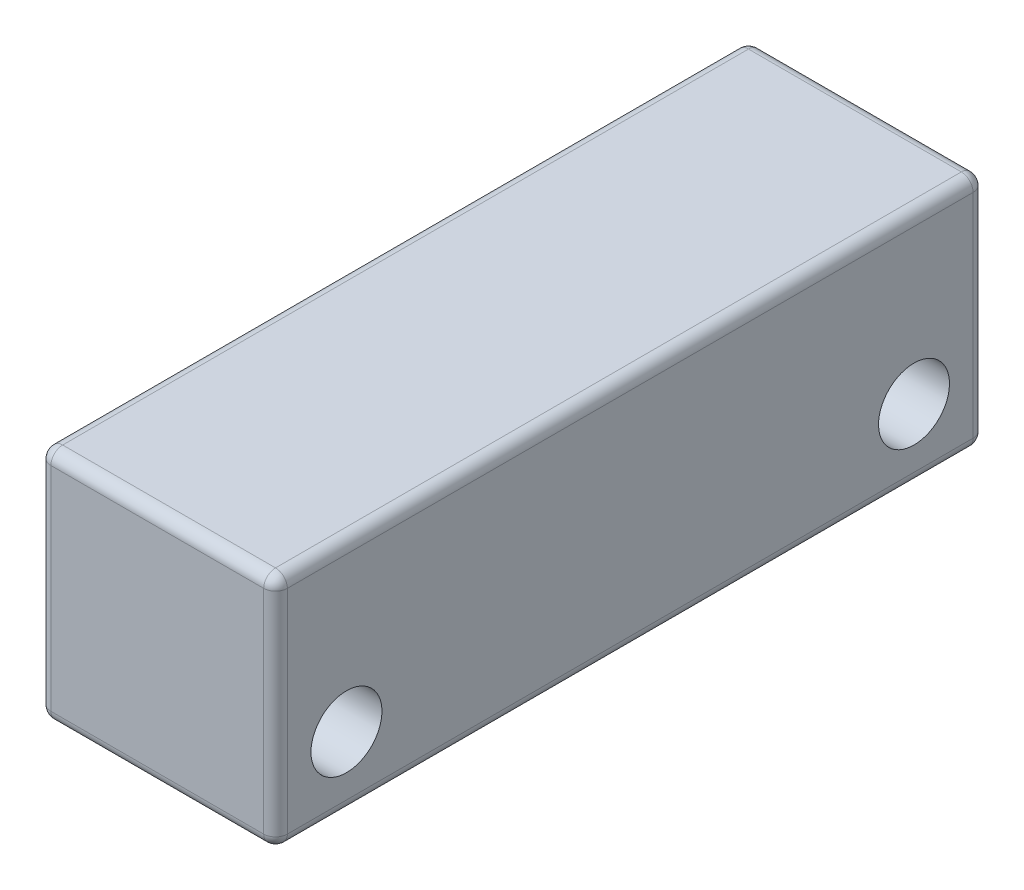
ISO-10303-21;
HEADER;
FILE_DESCRIPTION(('STEP AP214'),'2;1');
FILE_NAME('part.step','',(''),(''),'','','');
FILE_SCHEMA(('AUTOMOTIVE_DESIGN { 1 0 10303 214 1 1 1 1 }'));
ENDSEC;
DATA;
#1=APPLICATION_CONTEXT('core data for automotive mechanical design processes');
#2=APPLICATION_PROTOCOL_DEFINITION('international standard','automotive_design',2000,#1);
#3=PRODUCT_CONTEXT('',#1,'mechanical');
#4=PRODUCT('Part','Part','',(#3));
#5=PRODUCT_RELATED_PRODUCT_CATEGORY('part','',(#4));
#6=PRODUCT_DEFINITION_FORMATION('','',#4);
#7=PRODUCT_DEFINITION_CONTEXT('part definition',#1,'design');
#8=PRODUCT_DEFINITION('design','',#6,#7);
#9=PRODUCT_DEFINITION_SHAPE('','',#8);
#10=(LENGTH_UNIT() NAMED_UNIT(*) SI_UNIT(.MILLI.,.METRE.));
#11=(NAMED_UNIT(*) PLANE_ANGLE_UNIT() SI_UNIT($,.RADIAN.));
#12=(NAMED_UNIT(*) SI_UNIT($,.STERADIAN.) SOLID_ANGLE_UNIT());
#13=UNCERTAINTY_MEASURE_WITH_UNIT(LENGTH_MEASURE(1.E-05),#10,'distance_accuracy_value','');
#14=(GEOMETRIC_REPRESENTATION_CONTEXT(3) GLOBAL_UNCERTAINTY_ASSIGNED_CONTEXT((#13)) GLOBAL_UNIT_ASSIGNED_CONTEXT((#10,
#11,#12)) REPRESENTATION_CONTEXT('',''));
#15=CARTESIAN_POINT('',(0.,0.,0.));
#16=DIRECTION('',(0.,0.,1.));
#17=DIRECTION('',(1.,0.,0.));
#18=AXIS2_PLACEMENT_3D('',#15,#16,#17);
#19=CARTESIAN_POINT('',(5.,5.,30.));
#20=DIRECTION('',(-1.,0.,0.));
#21=DIRECTION('',(0.,0.,1.));
#22=AXIS2_PLACEMENT_3D('',#19,#20,#21);
#23=PLANE('',#22);
#24=CARTESIAN_POINT('',(5.,-2.,27.));
#25=DIRECTION('',(-1.,0.,0.));
#26=DIRECTION('',(0.,0.,1.));
#27=AXIS2_PLACEMENT_3D('',#24,#25,#26);
#28=CIRCLE('',#27,1.5);
#29=CARTESIAN_POINT('',(5.,-2.,28.5));
#30=VERTEX_POINT('',#29);
#31=EDGE_CURVE('E140',#30,#30,#28,.T.);
#32=ORIENTED_EDGE('',*,*,#31,.T.);
#33=EDGE_LOOP('',(#32));
#34=FACE_BOUND('',#33,.T.);
#35=DIRECTION('',(0.,1.,0.));
#36=VECTOR('',#35,1.);
#37=CARTESIAN_POINT('',(5.,5.,0.5));
#38=LINE('',#37,#36);
#39=CARTESIAN_POINT('',(5.,-4.5,0.5));
#40=VERTEX_POINT('',#39);
#41=CARTESIAN_POINT('',(5.,4.5,0.5));
#42=VERTEX_POINT('',#41);
#43=EDGE_CURVE('E188',#40,#42,#38,.T.);
#44=ORIENTED_EDGE('',*,*,#43,.T.);
#45=DIRECTION('',(0.,0.,-1.));
#46=VECTOR('',#45,1.);
#47=CARTESIAN_POINT('',(5.,4.5,30.));
#48=LINE('',#47,#46);
#49=CARTESIAN_POINT('',(5.,4.5,29.5));
#50=VERTEX_POINT('',#49);
#51=EDGE_CURVE('E195',#42,#50,#48,.F.);
#52=ORIENTED_EDGE('',*,*,#51,.T.);
#53=DIRECTION('',(0.,1.,0.));
#54=VECTOR('',#53,1.);
#55=CARTESIAN_POINT('',(5.,-5.,29.5));
#56=LINE('',#55,#54);
#57=CARTESIAN_POINT('',(5.,-4.5,29.5));
#58=VERTEX_POINT('',#57);
#59=EDGE_CURVE('E191',#50,#58,#56,.F.);
#60=ORIENTED_EDGE('',*,*,#59,.T.);
#61=DIRECTION('',(0.,0.,-1.));
#62=VECTOR('',#61,1.);
#63=CARTESIAN_POINT('',(5.,-4.5,30.));
#64=LINE('',#63,#62);
#65=EDGE_CURVE('E185',#58,#40,#64,.T.);
#66=ORIENTED_EDGE('',*,*,#65,.T.);
#67=EDGE_LOOP('',(#44,#52,#60,#66));
#68=FACE_BOUND('',#67,.T.);
#69=CARTESIAN_POINT('',(5.,-2.,3.));
#70=DIRECTION('',(1.,0.,0.));
#71=DIRECTION('',(0.,1.,0.));
#72=AXIS2_PLACEMENT_3D('',#69,#70,#71);
#73=CIRCLE('',#72,1.5);
#74=CARTESIAN_POINT('',(5.,-0.500000000000001,3.));
#75=VERTEX_POINT('',#74);
#76=EDGE_CURVE('E309',#75,#75,#73,.T.);
#77=ORIENTED_EDGE('',*,*,#76,.F.);
#78=EDGE_LOOP('',(#77));
#79=FACE_BOUND('',#78,.T.);
#80=ADVANCED_FACE('F38',(#34,#68,#79),#23,.F.);
#81=CARTESIAN_POINT('',(-5.,5.,30.));
#82=DIRECTION('',(0.,-1.,0.));
#83=DIRECTION('',(0.,0.,-1.));
#84=AXIS2_PLACEMENT_3D('',#81,#82,#83);
#85=PLANE('',#84);
#86=DIRECTION('',(-1.,0.,0.));
#87=VECTOR('',#86,1.);
#88=CARTESIAN_POINT('',(5.,5.,29.5));
#89=LINE('',#88,#87);
#90=CARTESIAN_POINT('',(-4.5,5.,29.5));
#91=VERTEX_POINT('',#90);
#92=CARTESIAN_POINT('',(4.5,5.,29.5));
#93=VERTEX_POINT('',#92);
#94=EDGE_CURVE('E217',#91,#93,#89,.F.);
#95=ORIENTED_EDGE('',*,*,#94,.T.);
#96=DIRECTION('',(0.,0.,-1.));
#97=VECTOR('',#96,1.);
#98=CARTESIAN_POINT('',(4.5,5.,30.));
#99=LINE('',#98,#97);
#100=CARTESIAN_POINT('',(4.5,5.,0.5));
#101=VERTEX_POINT('',#100);
#102=EDGE_CURVE('E220',#93,#101,#99,.T.);
#103=ORIENTED_EDGE('',*,*,#102,.T.);
#104=DIRECTION('',(-1.,0.,0.));
#105=VECTOR('',#104,1.);
#106=CARTESIAN_POINT('',(-5.,5.,0.5));
#107=LINE('',#106,#105);
#108=CARTESIAN_POINT('',(-4.5,5.,0.5));
#109=VERTEX_POINT('',#108);
#110=EDGE_CURVE('E211',#101,#109,#107,.T.);
#111=ORIENTED_EDGE('',*,*,#110,.T.);
#112=DIRECTION('',(0.,0.,-1.));
#113=VECTOR('',#112,1.);
#114=CARTESIAN_POINT('',(-4.5,5.,30.));
#115=LINE('',#114,#113);
#116=EDGE_CURVE('E214',#109,#91,#115,.F.);
#117=ORIENTED_EDGE('',*,*,#116,.T.);
#118=EDGE_LOOP('',(#95,#103,#111,#117));
#119=FACE_BOUND('',#118,.T.);
#120=ADVANCED_FACE('F343',(#119),#85,.F.);
#121=CARTESIAN_POINT('',(-5.,5.,30.));
#122=DIRECTION('',(1.,0.,0.));
#123=DIRECTION('',(0.,0.,-1.));
#124=AXIS2_PLACEMENT_3D('',#121,#122,#123);
#125=PLANE('',#124);
#126=CARTESIAN_POINT('',(-5.,-2.,27.));
#127=DIRECTION('',(-1.,0.,0.));
#128=DIRECTION('',(0.,0.,1.));
#129=AXIS2_PLACEMENT_3D('',#126,#127,#128);
#130=CIRCLE('',#129,1.5);
#131=CARTESIAN_POINT('',(-5.,-2.,28.5));
#132=VERTEX_POINT('',#131);
#133=EDGE_CURVE('E323',#132,#132,#130,.T.);
#134=ORIENTED_EDGE('',*,*,#133,.F.);
#135=EDGE_LOOP('',(#134));
#136=FACE_BOUND('',#135,.T.);
#137=DIRECTION('',(0.,-1.,0.));
#138=VECTOR('',#137,1.);
#139=CARTESIAN_POINT('',(-5.,5.,29.5));
#140=LINE('',#139,#138);
#141=CARTESIAN_POINT('',(-5.,-4.5,29.5));
#142=VERTEX_POINT('',#141);
#143=CARTESIAN_POINT('',(-5.,4.5,29.5));
#144=VERTEX_POINT('',#143);
#145=EDGE_CURVE('E135',#142,#144,#140,.F.);
#146=ORIENTED_EDGE('',*,*,#145,.T.);
#147=DIRECTION('',(0.,0.,-1.));
#148=VECTOR('',#147,1.);
#149=CARTESIAN_POINT('',(-5.,4.5,30.));
#150=LINE('',#149,#148);
#151=CARTESIAN_POINT('',(-5.,4.5,0.5));
#152=VERTEX_POINT('',#151);
#153=EDGE_CURVE('E182',#144,#152,#150,.T.);
#154=ORIENTED_EDGE('',*,*,#153,.T.);
#155=DIRECTION('',(0.,-1.,0.));
#156=VECTOR('',#155,1.);
#157=CARTESIAN_POINT('',(-5.,5.,0.5));
#158=LINE('',#157,#156);
#159=CARTESIAN_POINT('',(-5.,-4.5,0.5));
#160=VERTEX_POINT('',#159);
#161=EDGE_CURVE('E177',#152,#160,#158,.T.);
#162=ORIENTED_EDGE('',*,*,#161,.T.);
#163=DIRECTION('',(0.,0.,-1.));
#164=VECTOR('',#163,1.);
#165=CARTESIAN_POINT('',(-5.,-4.5,30.));
#166=LINE('',#165,#164);
#167=EDGE_CURVE('E171',#160,#142,#166,.F.);
#168=ORIENTED_EDGE('',*,*,#167,.T.);
#169=EDGE_LOOP('',(#146,#154,#162,#168));
#170=FACE_BOUND('',#169,.T.);
#171=CARTESIAN_POINT('',(-5.,-2.,3.));
#172=DIRECTION('',(1.,0.,0.));
#173=DIRECTION('',(0.,0.,-1.));
#174=AXIS2_PLACEMENT_3D('',#171,#172,#173);
#175=CIRCLE('',#174,1.5);
#176=CARTESIAN_POINT('',(-5.,-2.,1.5));
#177=VERTEX_POINT('',#176);
#178=EDGE_CURVE('E161',#177,#177,#175,.T.);
#179=ORIENTED_EDGE('',*,*,#178,.T.);
#180=EDGE_LOOP('',(#179));
#181=FACE_BOUND('',#180,.T.);
#182=ADVANCED_FACE('F339',(#136,#170,#181),#125,.F.);
#183=CARTESIAN_POINT('',(-5.,-5.,30.));
#184=DIRECTION('',(0.,1.,0.));
#185=DIRECTION('',(0.,0.,1.));
#186=AXIS2_PLACEMENT_3D('',#183,#184,#185);
#187=PLANE('',#186);
#188=DIRECTION('',(1.,0.,0.));
#189=VECTOR('',#188,1.);
#190=CARTESIAN_POINT('',(-5.,-5.,29.5));
#191=LINE('',#190,#189);
#192=CARTESIAN_POINT('',(4.5,-5.,29.5));
#193=VERTEX_POINT('',#192);
#194=CARTESIAN_POINT('',(-4.5,-5.,29.5));
#195=VERTEX_POINT('',#194);
#196=EDGE_CURVE('E48',#193,#195,#191,.F.);
#197=ORIENTED_EDGE('',*,*,#196,.T.);
#198=DIRECTION('',(0.,0.,-1.));
#199=VECTOR('',#198,1.);
#200=CARTESIAN_POINT('',(-4.5,-5.,30.));
#201=LINE('',#200,#199);
#202=CARTESIAN_POINT('',(-4.5,-5.,0.5));
#203=VERTEX_POINT('',#202);
#204=EDGE_CURVE('E11',#195,#203,#201,.T.);
#205=ORIENTED_EDGE('',*,*,#204,.T.);
#206=DIRECTION('',(1.,0.,0.));
#207=VECTOR('',#206,1.);
#208=CARTESIAN_POINT('',(-5.,-5.,0.5));
#209=LINE('',#208,#207);
#210=CARTESIAN_POINT('',(4.5,-5.,0.5));
#211=VERTEX_POINT('',#210);
#212=EDGE_CURVE('E224',#203,#211,#209,.T.);
#213=ORIENTED_EDGE('',*,*,#212,.T.);
#214=DIRECTION('',(0.,0.,-1.));
#215=VECTOR('',#214,1.);
#216=CARTESIAN_POINT('',(4.5,-5.,30.));
#217=LINE('',#216,#215);
#218=EDGE_CURVE('E59',#211,#193,#217,.F.);
#219=ORIENTED_EDGE('',*,*,#218,.T.);
#220=EDGE_LOOP('',(#197,#205,#213,#219));
#221=FACE_BOUND('',#220,.T.);
#222=ADVANCED_FACE('F342',(#221),#187,.F.);
#223=CARTESIAN_POINT('',(0.,0.,30.));
#224=DIRECTION('',(0.,0.,1.));
#225=DIRECTION('',(1.,0.,0.));
#226=AXIS2_PLACEMENT_3D('',#223,#224,#225);
#227=PLANE('',#226);
#228=DIRECTION('',(0.,1.,0.));
#229=VECTOR('',#228,1.);
#230=CARTESIAN_POINT('',(4.5,5.,30.));
#231=LINE('',#230,#229);
#232=CARTESIAN_POINT('',(4.5,-4.5,30.));
#233=VERTEX_POINT('',#232);
#234=CARTESIAN_POINT('',(4.5,4.5,30.));
#235=VERTEX_POINT('',#234);
#236=EDGE_CURVE('E160',#233,#235,#231,.T.);
#237=ORIENTED_EDGE('',*,*,#236,.T.);
#238=DIRECTION('',(-1.,0.,0.));
#239=VECTOR('',#238,1.);
#240=CARTESIAN_POINT('',(-5.,4.5,30.));
#241=LINE('',#240,#239);
#242=CARTESIAN_POINT('',(-4.5,4.5,30.));
#243=VERTEX_POINT('',#242);
#244=EDGE_CURVE('E165',#235,#243,#241,.T.);
#245=ORIENTED_EDGE('',*,*,#244,.T.);
#246=DIRECTION('',(0.,-1.,0.));
#247=VECTOR('',#246,1.);
#248=CARTESIAN_POINT('',(-4.5,-5.,30.));
#249=LINE('',#248,#247);
#250=CARTESIAN_POINT('',(-4.5,-4.5,30.));
#251=VERTEX_POINT('',#250);
#252=EDGE_CURVE('E133',#243,#251,#249,.T.);
#253=ORIENTED_EDGE('',*,*,#252,.T.);
#254=DIRECTION('',(1.,0.,0.));
#255=VECTOR('',#254,1.);
#256=CARTESIAN_POINT('',(5.,-4.5,30.));
#257=LINE('',#256,#255);
#258=EDGE_CURVE('E153',#251,#233,#257,.T.);
#259=ORIENTED_EDGE('',*,*,#258,.T.);
#260=EDGE_LOOP('',(#237,#245,#253,#259));
#261=FACE_BOUND('',#260,.T.);
#262=ADVANCED_FACE('F163',(#261),#227,.T.);
#263=CARTESIAN_POINT('',(0.,0.,0.));
#264=DIRECTION('',(0.,0.,1.));
#265=DIRECTION('',(1.,0.,0.));
#266=AXIS2_PLACEMENT_3D('',#263,#264,#265);
#267=PLANE('',#266);
#268=DIRECTION('',(0.,-1.,0.));
#269=VECTOR('',#268,1.);
#270=CARTESIAN_POINT('',(-4.5,0.,0.));
#271=LINE('',#270,#269);
#272=CARTESIAN_POINT('',(-4.5,-4.5,0.));
#273=VERTEX_POINT('',#272);
#274=CARTESIAN_POINT('',(-4.5,4.5,0.));
#275=VERTEX_POINT('',#274);
#276=EDGE_CURVE('E204',#273,#275,#271,.F.);
#277=ORIENTED_EDGE('',*,*,#276,.T.);
#278=DIRECTION('',(-1.,0.,0.));
#279=VECTOR('',#278,1.);
#280=CARTESIAN_POINT('',(0.,4.5,0.));
#281=LINE('',#280,#279);
#282=CARTESIAN_POINT('',(4.5,4.5,0.));
#283=VERTEX_POINT('',#282);
#284=EDGE_CURVE('E208',#275,#283,#281,.F.);
#285=ORIENTED_EDGE('',*,*,#284,.T.);
#286=DIRECTION('',(0.,1.,0.));
#287=VECTOR('',#286,1.);
#288=CARTESIAN_POINT('',(4.5,0.,0.));
#289=LINE('',#288,#287);
#290=CARTESIAN_POINT('',(4.5,-4.5,0.));
#291=VERTEX_POINT('',#290);
#292=EDGE_CURVE('E201',#283,#291,#289,.F.);
#293=ORIENTED_EDGE('',*,*,#292,.T.);
#294=DIRECTION('',(1.,0.,0.));
#295=VECTOR('',#294,1.);
#296=CARTESIAN_POINT('',(0.,-4.5,0.));
#297=LINE('',#296,#295);
#298=EDGE_CURVE('E198',#291,#273,#297,.F.);
#299=ORIENTED_EDGE('',*,*,#298,.T.);
#300=EDGE_LOOP('',(#277,#285,#293,#299));
#301=FACE_BOUND('',#300,.T.);
#302=ADVANCED_FACE('F350',(#301),#267,.F.);
#303=CARTESIAN_POINT('',(-25.,-2.,3.));
#304=DIRECTION('',(1.,0.,0.));
#305=DIRECTION('',(0.,1.,0.));
#306=AXIS2_PLACEMENT_3D('',#303,#304,#305);
#307=CYLINDRICAL_SURFACE('',#306,1.5);
#308=ORIENTED_EDGE('',*,*,#76,.T.);
#309=EDGE_LOOP('',(#308));
#310=FACE_BOUND('',#309,.T.);
#311=ORIENTED_EDGE('',*,*,#178,.F.);
#312=EDGE_LOOP('',(#311));
#313=FACE_BOUND('',#312,.T.);
#314=ADVANCED_FACE('F348',(#310,#313),#307,.F.);
#315=CARTESIAN_POINT('',(4.5,5.,0.5));
#316=DIRECTION('',(0.,1.,0.));
#317=DIRECTION('',(0.,0.,1.));
#318=AXIS2_PLACEMENT_3D('',#315,#316,#317);
#319=CYLINDRICAL_SURFACE('',#318,0.5);
#320=CARTESIAN_POINT('',(4.5,4.5,0.5));
#321=DIRECTION('',(0.,1.,0.));
#322=DIRECTION('',(0.,0.,1.));
#323=AXIS2_PLACEMENT_3D('',#320,#321,#322);
#324=CIRCLE('',#323,0.5);
#325=EDGE_CURVE('E42',#42,#283,#324,.T.);
#326=ORIENTED_EDGE('',*,*,#325,.F.);
#327=ORIENTED_EDGE('',*,*,#43,.F.);
#328=CARTESIAN_POINT('',(4.5,-4.5,0.5));
#329=DIRECTION('',(0.,-1.,0.));
#330=DIRECTION('',(0.,0.,-1.));
#331=AXIS2_PLACEMENT_3D('',#328,#329,#330);
#332=CIRCLE('',#331,0.5);
#333=EDGE_CURVE('E300',#291,#40,#332,.T.);
#334=ORIENTED_EDGE('',*,*,#333,.F.);
#335=ORIENTED_EDGE('',*,*,#292,.F.);
#336=EDGE_LOOP('',(#326,#327,#334,#335));
#337=FACE_BOUND('',#336,.T.);
#338=ADVANCED_FACE('F40',(#337),#319,.T.);
#339=CARTESIAN_POINT('',(4.5,4.5,0.5));
#340=DIRECTION('',(0.,0.,-1.));
#341=DIRECTION('',(-1.,0.,0.));
#342=AXIS2_PLACEMENT_3D('',#339,#340,#341);
#343=SPHERICAL_SURFACE('',#342,0.5);
#344=CARTESIAN_POINT('',(4.5,4.5,0.5));
#345=DIRECTION('',(0.,0.,-1.));
#346=DIRECTION('',(-1.,0.,0.));
#347=AXIS2_PLACEMENT_3D('',#344,#345,#346);
#348=CIRCLE('',#347,0.5);
#349=EDGE_CURVE('E293',#42,#101,#348,.F.);
#350=ORIENTED_EDGE('',*,*,#349,.F.);
#351=ORIENTED_EDGE('',*,*,#325,.T.);
#352=CARTESIAN_POINT('',(4.5,4.5,0.5));
#353=DIRECTION('',(1.,0.,0.));
#354=DIRECTION('',(0.,1.,0.));
#355=AXIS2_PLACEMENT_3D('',#352,#353,#354);
#356=CIRCLE('',#355,0.5);
#357=EDGE_CURVE('E297',#101,#283,#356,.F.);
#358=ORIENTED_EDGE('',*,*,#357,.F.);
#359=EDGE_LOOP('',(#350,#351,#358));
#360=FACE_BOUND('',#359,.T.);
#361=ADVANCED_FACE('F356',(#360),#343,.T.);
#362=CARTESIAN_POINT('',(4.5,-4.5,0.5));
#363=DIRECTION('',(1.,0.,0.));
#364=DIRECTION('',(0.,0.,-1.));
#365=AXIS2_PLACEMENT_3D('',#362,#363,#364);
#366=SPHERICAL_SURFACE('',#365,0.5);
#367=CARTESIAN_POINT('',(4.5,-4.5,0.5));
#368=DIRECTION('',(1.,0.,0.));
#369=DIRECTION('',(0.,0.,-1.));
#370=AXIS2_PLACEMENT_3D('',#367,#368,#369);
#371=CIRCLE('',#370,0.5);
#372=EDGE_CURVE('E285',#291,#211,#371,.F.);
#373=ORIENTED_EDGE('',*,*,#372,.F.);
#374=ORIENTED_EDGE('',*,*,#333,.T.);
#375=CARTESIAN_POINT('',(4.5,-4.5,0.5));
#376=DIRECTION('',(0.,0.,-1.));
#377=DIRECTION('',(-1.,0.,0.));
#378=AXIS2_PLACEMENT_3D('',#375,#376,#377);
#379=CIRCLE('',#378,0.5);
#380=EDGE_CURVE('E289',#211,#40,#379,.F.);
#381=ORIENTED_EDGE('',*,*,#380,.F.);
#382=EDGE_LOOP('',(#373,#374,#381));
#383=FACE_BOUND('',#382,.T.);
#384=ADVANCED_FACE('F431',(#383),#366,.T.);
#385=CARTESIAN_POINT('',(-5.,4.5,0.5));
#386=DIRECTION('',(-1.,0.,0.));
#387=DIRECTION('',(0.,0.,1.));
#388=AXIS2_PLACEMENT_3D('',#385,#386,#387);
#389=CYLINDRICAL_SURFACE('',#388,0.5);
#390=ORIENTED_EDGE('',*,*,#357,.T.);
#391=ORIENTED_EDGE('',*,*,#284,.F.);
#392=CARTESIAN_POINT('',(-4.5,4.5,0.5));
#393=DIRECTION('',(-1.,0.,0.));
#394=DIRECTION('',(0.,0.,1.));
#395=AXIS2_PLACEMENT_3D('',#392,#393,#394);
#396=CIRCLE('',#395,0.5);
#397=EDGE_CURVE('E278',#109,#275,#396,.T.);
#398=ORIENTED_EDGE('',*,*,#397,.F.);
#399=ORIENTED_EDGE('',*,*,#110,.F.);
#400=EDGE_LOOP('',(#390,#391,#398,#399));
#401=FACE_BOUND('',#400,.T.);
#402=ADVANCED_FACE('F427',(#401),#389,.T.);
#403=CARTESIAN_POINT('',(4.5,4.5,30.));
#404=DIRECTION('',(0.,0.,-1.));
#405=DIRECTION('',(-1.,0.,0.));
#406=AXIS2_PLACEMENT_3D('',#403,#404,#405);
#407=CYLINDRICAL_SURFACE('',#406,0.5);
#408=ORIENTED_EDGE('',*,*,#349,.T.);
#409=ORIENTED_EDGE('',*,*,#102,.F.);
#410=CARTESIAN_POINT('',(4.5,4.5,29.5));
#411=DIRECTION('',(0.,0.,1.));
#412=DIRECTION('',(1.,0.,0.));
#413=AXIS2_PLACEMENT_3D('',#410,#411,#412);
#414=CIRCLE('',#413,0.5);
#415=EDGE_CURVE('E274',#50,#93,#414,.T.);
#416=ORIENTED_EDGE('',*,*,#415,.F.);
#417=ORIENTED_EDGE('',*,*,#51,.F.);
#418=EDGE_LOOP('',(#408,#409,#416,#417));
#419=FACE_BOUND('',#418,.T.);
#420=ADVANCED_FACE('F423',(#419),#407,.T.);
#421=CARTESIAN_POINT('',(4.5,0.,29.5));
#422=DIRECTION('',(0.,-1.,0.));
#423=DIRECTION('',(0.,0.,-1.));
#424=AXIS2_PLACEMENT_3D('',#421,#422,#423);
#425=CYLINDRICAL_SURFACE('',#424,0.5);
#426=CARTESIAN_POINT('',(4.5,-4.5,29.5));
#427=DIRECTION('',(0.,-1.,0.));
#428=DIRECTION('',(0.,0.,-1.));
#429=AXIS2_PLACEMENT_3D('',#426,#427,#428);
#430=CIRCLE('',#429,0.5);
#431=EDGE_CURVE('E266',#58,#233,#430,.T.);
#432=ORIENTED_EDGE('',*,*,#431,.F.);
#433=ORIENTED_EDGE('',*,*,#59,.F.);
#434=CARTESIAN_POINT('',(4.5,4.5,29.5));
#435=DIRECTION('',(0.,1.,0.));
#436=DIRECTION('',(0.,0.,1.));
#437=AXIS2_PLACEMENT_3D('',#434,#435,#436);
#438=CIRCLE('',#437,0.5);
#439=EDGE_CURVE('E270',#235,#50,#438,.T.);
#440=ORIENTED_EDGE('',*,*,#439,.F.);
#441=ORIENTED_EDGE('',*,*,#236,.F.);
#442=EDGE_LOOP('',(#432,#433,#440,#441));
#443=FACE_BOUND('',#442,.T.);
#444=ADVANCED_FACE('F419',(#443),#425,.T.);
#445=CARTESIAN_POINT('',(4.5,-4.5,30.));
#446=DIRECTION('',(0.,0.,-1.));
#447=DIRECTION('',(-1.,0.,0.));
#448=AXIS2_PLACEMENT_3D('',#445,#446,#447);
#449=CYLINDRICAL_SURFACE('',#448,0.5);
#450=ORIENTED_EDGE('',*,*,#380,.T.);
#451=ORIENTED_EDGE('',*,*,#65,.F.);
#452=CARTESIAN_POINT('',(4.5,-4.5,29.5));
#453=DIRECTION('',(0.,0.,1.));
#454=DIRECTION('',(1.,0.,0.));
#455=AXIS2_PLACEMENT_3D('',#452,#453,#454);
#456=CIRCLE('',#455,0.5);
#457=EDGE_CURVE('E263',#193,#58,#456,.T.);
#458=ORIENTED_EDGE('',*,*,#457,.F.);
#459=ORIENTED_EDGE('',*,*,#218,.F.);
#460=EDGE_LOOP('',(#450,#451,#458,#459));
#461=FACE_BOUND('',#460,.T.);
#462=ADVANCED_FACE('F415',(#461),#449,.T.);
#463=CARTESIAN_POINT('',(-5.,-4.5,0.5));
#464=DIRECTION('',(1.,0.,0.));
#465=DIRECTION('',(0.,0.,-1.));
#466=AXIS2_PLACEMENT_3D('',#463,#464,#465);
#467=CYLINDRICAL_SURFACE('',#466,0.5);
#468=ORIENTED_EDGE('',*,*,#372,.T.);
#469=ORIENTED_EDGE('',*,*,#212,.F.);
#470=CARTESIAN_POINT('',(-4.5,-4.5,0.5));
#471=DIRECTION('',(-1.,0.,0.));
#472=DIRECTION('',(0.,0.,1.));
#473=AXIS2_PLACEMENT_3D('',#470,#471,#472);
#474=CIRCLE('',#473,0.5);
#475=EDGE_CURVE('E259',#273,#203,#474,.T.);
#476=ORIENTED_EDGE('',*,*,#475,.F.);
#477=ORIENTED_EDGE('',*,*,#298,.F.);
#478=EDGE_LOOP('',(#468,#469,#476,#477));
#479=FACE_BOUND('',#478,.T.);
#480=ADVANCED_FACE('F411',(#479),#467,.T.);
#481=CARTESIAN_POINT('',(-4.5,5.,0.5));
#482=DIRECTION('',(0.,-1.,0.));
#483=DIRECTION('',(0.,0.,-1.));
#484=AXIS2_PLACEMENT_3D('',#481,#482,#483);
#485=CYLINDRICAL_SURFACE('',#484,0.5);
#486=CARTESIAN_POINT('',(-4.5,4.5,0.5));
#487=DIRECTION('',(0.,1.,0.));
#488=DIRECTION('',(0.,0.,1.));
#489=AXIS2_PLACEMENT_3D('',#486,#487,#488);
#490=CIRCLE('',#489,0.5);
#491=EDGE_CURVE('E281',#275,#152,#490,.T.);
#492=ORIENTED_EDGE('',*,*,#491,.F.);
#493=ORIENTED_EDGE('',*,*,#276,.F.);
#494=CARTESIAN_POINT('',(-4.5,-4.5,0.5));
#495=DIRECTION('',(0.,-1.,0.));
#496=DIRECTION('',(0.,0.,-1.));
#497=AXIS2_PLACEMENT_3D('',#494,#495,#496);
#498=CIRCLE('',#497,0.5);
#499=EDGE_CURVE('E255',#160,#273,#498,.T.);
#500=ORIENTED_EDGE('',*,*,#499,.F.);
#501=ORIENTED_EDGE('',*,*,#161,.F.);
#502=EDGE_LOOP('',(#492,#493,#500,#501));
#503=FACE_BOUND('',#502,.T.);
#504=ADVANCED_FACE('F407',(#503),#485,.T.);
#505=CARTESIAN_POINT('',(-4.5,4.5,0.5));
#506=DIRECTION('',(0.,0.,-1.));
#507=DIRECTION('',(-1.,0.,0.));
#508=AXIS2_PLACEMENT_3D('',#505,#506,#507);
#509=SPHERICAL_SURFACE('',#508,0.5);
#510=ORIENTED_EDGE('',*,*,#397,.T.);
#511=ORIENTED_EDGE('',*,*,#491,.T.);
#512=CARTESIAN_POINT('',(-4.5,4.5,0.5));
#513=DIRECTION('',(0.,0.,-1.));
#514=DIRECTION('',(-1.,0.,0.));
#515=AXIS2_PLACEMENT_3D('',#512,#513,#514);
#516=CIRCLE('',#515,0.5);
#517=EDGE_CURVE('E251',#109,#152,#516,.F.);
#518=ORIENTED_EDGE('',*,*,#517,.F.);
#519=EDGE_LOOP('',(#510,#511,#518));
#520=FACE_BOUND('',#519,.T.);
#521=ADVANCED_FACE('F403',(#520),#509,.T.);
#522=CARTESIAN_POINT('',(4.5,4.5,29.5));
#523=DIRECTION('',(1.,0.,0.));
#524=DIRECTION('',(0.,0.,-1.));
#525=AXIS2_PLACEMENT_3D('',#522,#523,#524);
#526=SPHERICAL_SURFACE('',#525,0.5);
#527=ORIENTED_EDGE('',*,*,#439,.T.);
#528=ORIENTED_EDGE('',*,*,#415,.T.);
#529=CARTESIAN_POINT('',(4.5,4.5,29.5));
#530=DIRECTION('',(1.,0.,0.));
#531=DIRECTION('',(0.,0.,-1.));
#532=AXIS2_PLACEMENT_3D('',#529,#530,#531);
#533=CIRCLE('',#532,0.5);
#534=EDGE_CURVE('E247',#235,#93,#533,.F.);
#535=ORIENTED_EDGE('',*,*,#534,.F.);
#536=EDGE_LOOP('',(#527,#528,#535));
#537=FACE_BOUND('',#536,.T.);
#538=ADVANCED_FACE('F399',(#537),#526,.T.);
#539=CARTESIAN_POINT('',(4.5,-4.5,29.5));
#540=DIRECTION('',(1.,0.,0.));
#541=DIRECTION('',(0.,0.,-1.));
#542=AXIS2_PLACEMENT_3D('',#539,#540,#541);
#543=SPHERICAL_SURFACE('',#542,0.5);
#544=ORIENTED_EDGE('',*,*,#457,.T.);
#545=ORIENTED_EDGE('',*,*,#431,.T.);
#546=CARTESIAN_POINT('',(4.5,-4.5,29.5));
#547=DIRECTION('',(1.,0.,0.));
#548=DIRECTION('',(0.,0.,-1.));
#549=AXIS2_PLACEMENT_3D('',#546,#547,#548);
#550=CIRCLE('',#549,0.5);
#551=EDGE_CURVE('E156',#193,#233,#550,.F.);
#552=ORIENTED_EDGE('',*,*,#551,.F.);
#553=EDGE_LOOP('',(#544,#545,#552));
#554=FACE_BOUND('',#553,.T.);
#555=ADVANCED_FACE('F395',(#554),#543,.T.);
#556=CARTESIAN_POINT('',(-4.5,-4.5,0.5));
#557=DIRECTION('',(0.,0.,-1.));
#558=DIRECTION('',(-1.,0.,0.));
#559=AXIS2_PLACEMENT_3D('',#556,#557,#558);
#560=SPHERICAL_SURFACE('',#559,0.5);
#561=ORIENTED_EDGE('',*,*,#499,.T.);
#562=ORIENTED_EDGE('',*,*,#475,.T.);
#563=CARTESIAN_POINT('',(-4.5,-4.5,0.5));
#564=DIRECTION('',(0.,0.,-1.));
#565=DIRECTION('',(-1.,0.,0.));
#566=AXIS2_PLACEMENT_3D('',#563,#564,#565);
#567=CIRCLE('',#566,0.5);
#568=EDGE_CURVE('E242',#160,#203,#567,.F.);
#569=ORIENTED_EDGE('',*,*,#568,.F.);
#570=EDGE_LOOP('',(#561,#562,#569));
#571=FACE_BOUND('',#570,.T.);
#572=ADVANCED_FACE('F391',(#571),#560,.T.);
#573=CARTESIAN_POINT('',(-4.5,4.5,30.));
#574=DIRECTION('',(0.,0.,-1.));
#575=DIRECTION('',(-1.,0.,0.));
#576=AXIS2_PLACEMENT_3D('',#573,#574,#575);
#577=CYLINDRICAL_SURFACE('',#576,0.5);
#578=ORIENTED_EDGE('',*,*,#517,.T.);
#579=ORIENTED_EDGE('',*,*,#153,.F.);
#580=CARTESIAN_POINT('',(-4.5,4.5,29.5));
#581=DIRECTION('',(0.,0.,1.));
#582=DIRECTION('',(1.,0.,0.));
#583=AXIS2_PLACEMENT_3D('',#580,#581,#582);
#584=CIRCLE('',#583,0.5);
#585=EDGE_CURVE('E238',#91,#144,#584,.T.);
#586=ORIENTED_EDGE('',*,*,#585,.F.);
#587=ORIENTED_EDGE('',*,*,#116,.F.);
#588=EDGE_LOOP('',(#578,#579,#586,#587));
#589=FACE_BOUND('',#588,.T.);
#590=ADVANCED_FACE('F387',(#589),#577,.T.);
#591=CARTESIAN_POINT('',(0.,4.5,29.5));
#592=DIRECTION('',(1.,0.,0.));
#593=DIRECTION('',(0.,0.,-1.));
#594=AXIS2_PLACEMENT_3D('',#591,#592,#593);
#595=CYLINDRICAL_SURFACE('',#594,0.5);
#596=ORIENTED_EDGE('',*,*,#534,.T.);
#597=ORIENTED_EDGE('',*,*,#94,.F.);
#598=CARTESIAN_POINT('',(-4.5,4.5,29.5));
#599=DIRECTION('',(-1.,0.,0.));
#600=DIRECTION('',(0.,0.,1.));
#601=AXIS2_PLACEMENT_3D('',#598,#599,#600);
#602=CIRCLE('',#601,0.5);
#603=EDGE_CURVE('E150',#243,#91,#602,.T.);
#604=ORIENTED_EDGE('',*,*,#603,.F.);
#605=ORIENTED_EDGE('',*,*,#244,.F.);
#606=EDGE_LOOP('',(#596,#597,#604,#605));
#607=FACE_BOUND('',#606,.T.);
#608=ADVANCED_FACE('F384',(#607),#595,.T.);
#609=CARTESIAN_POINT('',(0.,-4.5,29.5));
#610=DIRECTION('',(-1.,0.,0.));
#611=DIRECTION('',(0.,0.,1.));
#612=AXIS2_PLACEMENT_3D('',#609,#610,#611);
#613=CYLINDRICAL_SURFACE('',#612,0.5);
#614=ORIENTED_EDGE('',*,*,#551,.T.);
#615=ORIENTED_EDGE('',*,*,#258,.F.);
#616=CARTESIAN_POINT('',(-4.5,-4.5,29.5));
#617=DIRECTION('',(-1.,0.,0.));
#618=DIRECTION('',(0.,0.,1.));
#619=AXIS2_PLACEMENT_3D('',#616,#617,#618);
#620=CIRCLE('',#619,0.5);
#621=EDGE_CURVE('E143',#195,#251,#620,.T.);
#622=ORIENTED_EDGE('',*,*,#621,.F.);
#623=ORIENTED_EDGE('',*,*,#196,.F.);
#624=EDGE_LOOP('',(#614,#615,#622,#623));
#625=FACE_BOUND('',#624,.T.);
#626=ADVANCED_FACE('F154',(#625),#613,.T.);
#627=CARTESIAN_POINT('',(-4.5,-4.5,30.));
#628=DIRECTION('',(0.,0.,-1.));
#629=DIRECTION('',(-1.,0.,0.));
#630=AXIS2_PLACEMENT_3D('',#627,#628,#629);
#631=CYLINDRICAL_SURFACE('',#630,0.5);
#632=ORIENTED_EDGE('',*,*,#568,.T.);
#633=ORIENTED_EDGE('',*,*,#204,.F.);
#634=CARTESIAN_POINT('',(-4.5,-4.5,29.5));
#635=DIRECTION('',(0.,0.,1.));
#636=DIRECTION('',(1.,0.,0.));
#637=AXIS2_PLACEMENT_3D('',#634,#635,#636);
#638=CIRCLE('',#637,0.5);
#639=EDGE_CURVE('E147',#142,#195,#638,.T.);
#640=ORIENTED_EDGE('',*,*,#639,.F.);
#641=ORIENTED_EDGE('',*,*,#167,.F.);
#642=EDGE_LOOP('',(#632,#633,#640,#641));
#643=FACE_BOUND('',#642,.T.);
#644=ADVANCED_FACE('F377',(#643),#631,.T.);
#645=CARTESIAN_POINT('',(-4.5,4.5,29.5));
#646=DIRECTION('',(0.,1.,0.));
#647=DIRECTION('',(0.,0.,1.));
#648=AXIS2_PLACEMENT_3D('',#645,#646,#647);
#649=SPHERICAL_SURFACE('',#648,0.5);
#650=ORIENTED_EDGE('',*,*,#603,.T.);
#651=ORIENTED_EDGE('',*,*,#585,.T.);
#652=CARTESIAN_POINT('',(-4.5,4.5,29.5));
#653=DIRECTION('',(0.,1.,0.));
#654=DIRECTION('',(0.,0.,1.));
#655=AXIS2_PLACEMENT_3D('',#652,#653,#654);
#656=CIRCLE('',#655,0.5);
#657=EDGE_CURVE('E139',#243,#144,#656,.F.);
#658=ORIENTED_EDGE('',*,*,#657,.F.);
#659=EDGE_LOOP('',(#650,#651,#658));
#660=FACE_BOUND('',#659,.T.);
#661=ADVANCED_FACE('F374',(#660),#649,.T.);
#662=CARTESIAN_POINT('',(-4.5,-4.5,29.5));
#663=DIRECTION('',(0.,-1.,0.));
#664=DIRECTION('',(0.,0.,-1.));
#665=AXIS2_PLACEMENT_3D('',#662,#663,#664);
#666=SPHERICAL_SURFACE('',#665,0.5);
#667=ORIENTED_EDGE('',*,*,#639,.T.);
#668=ORIENTED_EDGE('',*,*,#621,.T.);
#669=CARTESIAN_POINT('',(-4.5,-4.5,29.5));
#670=DIRECTION('',(0.,-1.,0.));
#671=DIRECTION('',(0.,0.,-1.));
#672=AXIS2_PLACEMENT_3D('',#669,#670,#671);
#673=CIRCLE('',#672,0.5);
#674=EDGE_CURVE('E129',#142,#251,#673,.F.);
#675=ORIENTED_EDGE('',*,*,#674,.F.);
#676=EDGE_LOOP('',(#667,#668,#675));
#677=FACE_BOUND('',#676,.T.);
#678=ADVANCED_FACE('F145',(#677),#666,.T.);
#679=CARTESIAN_POINT('',(-4.5,0.,29.5));
#680=DIRECTION('',(0.,1.,0.));
#681=DIRECTION('',(0.,0.,1.));
#682=AXIS2_PLACEMENT_3D('',#679,#680,#681);
#683=CYLINDRICAL_SURFACE('',#682,0.5);
#684=ORIENTED_EDGE('',*,*,#657,.T.);
#685=ORIENTED_EDGE('',*,*,#145,.F.);
#686=ORIENTED_EDGE('',*,*,#674,.T.);
#687=ORIENTED_EDGE('',*,*,#252,.F.);
#688=EDGE_LOOP('',(#684,#685,#686,#687));
#689=FACE_BOUND('',#688,.T.);
#690=ADVANCED_FACE('F131',(#689),#683,.T.);
#691=CARTESIAN_POINT('',(5.,-2.,27.));
#692=DIRECTION('',(-1.,0.,0.));
#693=DIRECTION('',(0.,0.,1.));
#694=AXIS2_PLACEMENT_3D('',#691,#692,#693);
#695=CYLINDRICAL_SURFACE('',#694,1.5);
#696=ORIENTED_EDGE('',*,*,#31,.F.);
#697=EDGE_LOOP('',(#696));
#698=FACE_BOUND('',#697,.T.);
#699=ORIENTED_EDGE('',*,*,#133,.T.);
#700=EDGE_LOOP('',(#699));
#701=FACE_BOUND('',#700,.T.);
#702=ADVANCED_FACE('F333',(#698,#701),#695,.F.);
#703=CLOSED_SHELL('',(#80,#120,#182,#222,#262,#302,#314,#338,#361,#384,#402,#420,#444,#462,#480,
#504,#521,#538,#555,#572,#590,#608,#626,#644,#661,#678,#690,#702));
#704=MANIFOLD_SOLID_BREP('B2',#703);
#705=ADVANCED_BREP_SHAPE_REPRESENTATION('',(#18,#704),#14);
#706=SHAPE_DEFINITION_REPRESENTATION(#9,#705);
ENDSEC;
END-ISO-10303-21;
